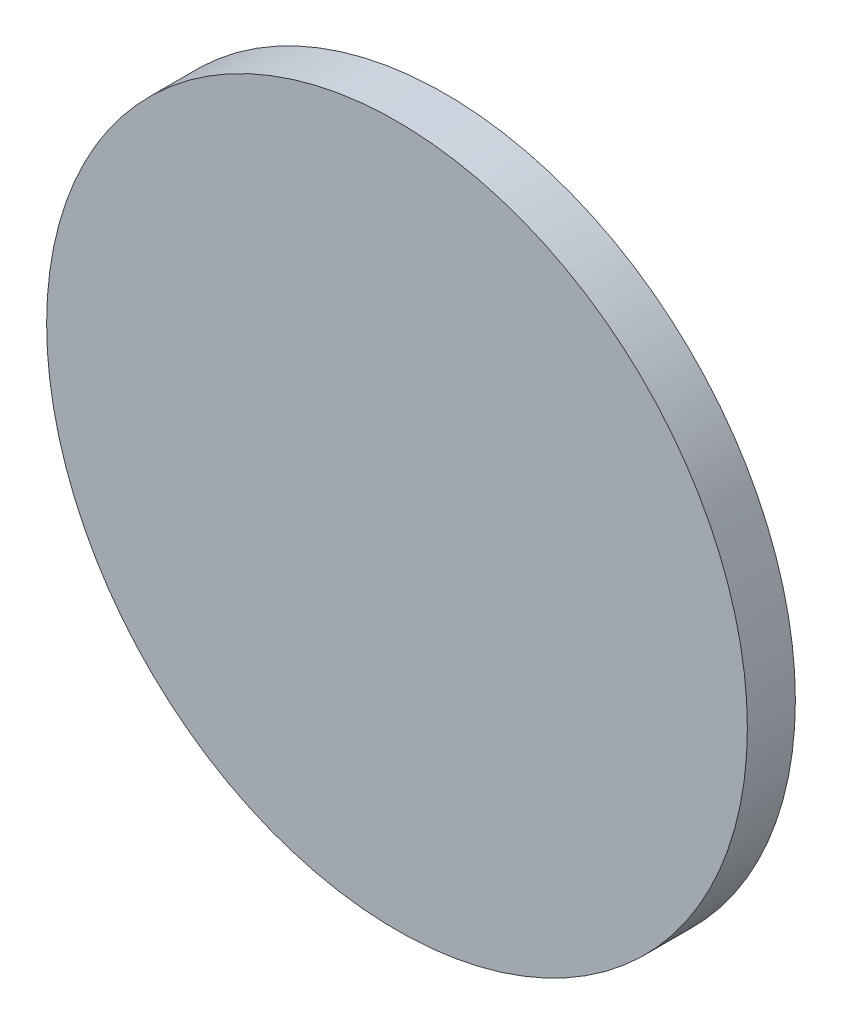
ISO-10303-21;
HEADER;
FILE_DESCRIPTION(('STEP AP214'),'2;1');
FILE_NAME('part.step','',(''),(''),'','','');
FILE_SCHEMA(('AUTOMOTIVE_DESIGN { 1 0 10303 214 1 1 1 1 }'));
ENDSEC;
DATA;
#1=APPLICATION_CONTEXT('core data for automotive mechanical design processes');
#2=APPLICATION_PROTOCOL_DEFINITION('international standard','automotive_design',2000,#1);
#3=PRODUCT_CONTEXT('',#1,'mechanical');
#4=PRODUCT('Part','Part','',(#3));
#5=PRODUCT_RELATED_PRODUCT_CATEGORY('part','',(#4));
#6=PRODUCT_DEFINITION_FORMATION('','',#4);
#7=PRODUCT_DEFINITION_CONTEXT('part definition',#1,'design');
#8=PRODUCT_DEFINITION('design','',#6,#7);
#9=PRODUCT_DEFINITION_SHAPE('','',#8);
#10=(LENGTH_UNIT() NAMED_UNIT(*) SI_UNIT(.MILLI.,.METRE.));
#11=(NAMED_UNIT(*) PLANE_ANGLE_UNIT() SI_UNIT($,.RADIAN.));
#12=(NAMED_UNIT(*) SI_UNIT($,.STERADIAN.) SOLID_ANGLE_UNIT());
#13=UNCERTAINTY_MEASURE_WITH_UNIT(LENGTH_MEASURE(1.E-05),#10,'distance_accuracy_value','');
#14=(GEOMETRIC_REPRESENTATION_CONTEXT(3) GLOBAL_UNCERTAINTY_ASSIGNED_CONTEXT((#13)) GLOBAL_UNIT_ASSIGNED_CONTEXT((#10,
#11,#12)) REPRESENTATION_CONTEXT('',''));
#15=CARTESIAN_POINT('',(0.,0.,0.));
#16=DIRECTION('',(0.,0.,1.));
#17=DIRECTION('',(1.,0.,0.));
#18=AXIS2_PLACEMENT_3D('',#15,#16,#17);
#19=CARTESIAN_POINT('',(0.,0.,0.8));
#20=DIRECTION('',(0.,0.,-1.));
#21=DIRECTION('',(-1.,0.,0.));
#22=AXIS2_PLACEMENT_3D('',#19,#20,#21);
#23=CYLINDRICAL_SURFACE('',#22,11.675);
#24=CARTESIAN_POINT('',(0.,0.,0.8));
#25=DIRECTION('',(0.,0.,1.));
#26=DIRECTION('',(1.,0.,0.));
#27=AXIS2_PLACEMENT_3D('',#24,#25,#26);
#28=CIRCLE('',#27,11.675);
#29=CARTESIAN_POINT('',(11.675,0.,0.8));
#30=VERTEX_POINT('',#29);
#31=EDGE_CURVE('E10',#30,#30,#28,.T.);
#32=ORIENTED_EDGE('',*,*,#31,.F.);
#33=EDGE_LOOP('',(#32));
#34=FACE_BOUND('',#33,.T.);
#35=CARTESIAN_POINT('',(0.,0.,-0.8));
#36=DIRECTION('',(0.,0.,1.));
#37=DIRECTION('',(1.,0.,0.));
#38=AXIS2_PLACEMENT_3D('',#35,#36,#37);
#39=CIRCLE('',#38,11.675);
#40=CARTESIAN_POINT('',(11.675,0.,-0.8));
#41=VERTEX_POINT('',#40);
#42=EDGE_CURVE('E34',#41,#41,#39,.T.);
#43=ORIENTED_EDGE('',*,*,#42,.T.);
#44=EDGE_LOOP('',(#43));
#45=FACE_BOUND('',#44,.T.);
#46=ADVANCED_FACE('F31',(#34,#45),#23,.T.);
#47=CARTESIAN_POINT('',(0.,0.,0.8));
#48=DIRECTION('',(0.,0.,1.));
#49=DIRECTION('',(1.,0.,0.));
#50=AXIS2_PLACEMENT_3D('',#47,#48,#49);
#51=PLANE('',#50);
#52=ORIENTED_EDGE('',*,*,#31,.T.);
#53=EDGE_LOOP('',(#52));
#54=FACE_BOUND('',#53,.T.);
#55=ADVANCED_FACE('F46',(#54),#51,.T.);
#56=CARTESIAN_POINT('',(0.,0.,-0.8));
#57=DIRECTION('',(0.,0.,1.));
#58=DIRECTION('',(1.,0.,0.));
#59=AXIS2_PLACEMENT_3D('',#56,#57,#58);
#60=PLANE('',#59);
#61=ORIENTED_EDGE('',*,*,#42,.F.);
#62=EDGE_LOOP('',(#61));
#63=FACE_BOUND('',#62,.T.);
#64=ADVANCED_FACE('F44',(#63),#60,.F.);
#65=CLOSED_SHELL('',(#46,#55,#64));
#66=MANIFOLD_SOLID_BREP('B2',#65);
#67=ADVANCED_BREP_SHAPE_REPRESENTATION('',(#18,#66),#14);
#68=SHAPE_DEFINITION_REPRESENTATION(#9,#67);
ENDSEC;
END-ISO-10303-21;
